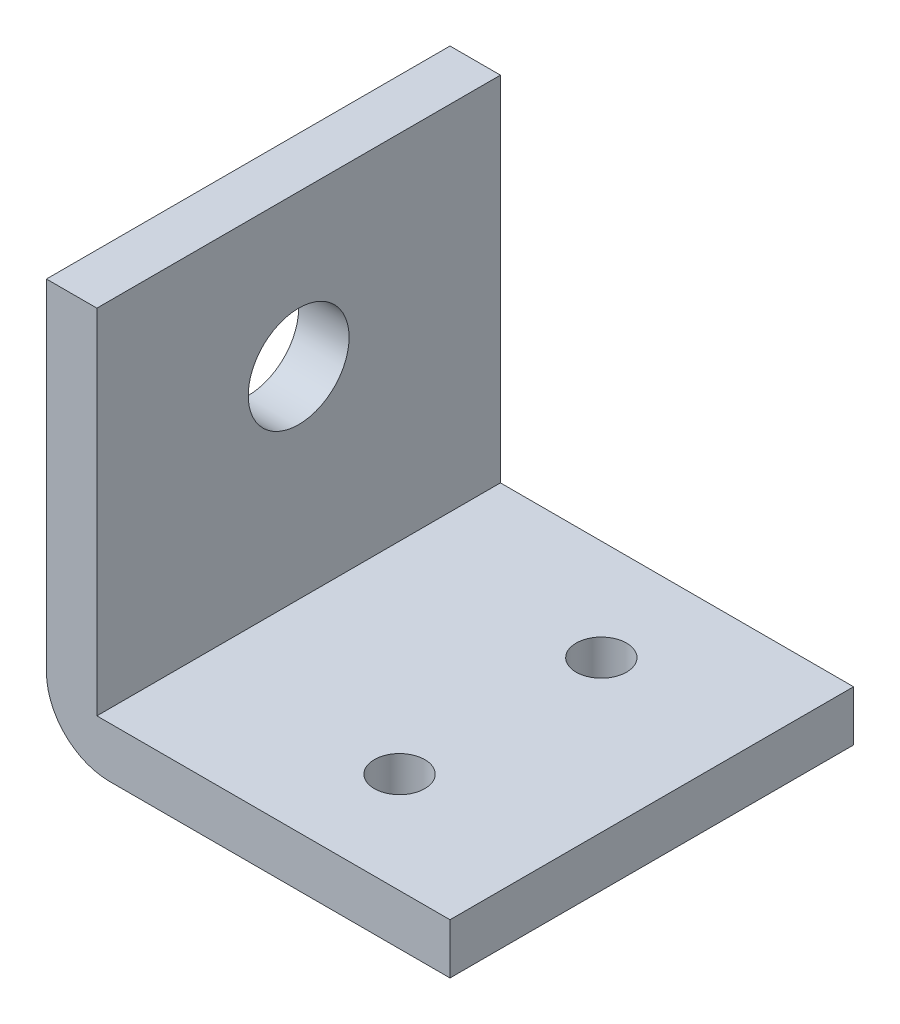
ISO-10303-21;
HEADER;
FILE_DESCRIPTION(('STEP AP214'),'2;1');
FILE_NAME('part.step','',(''),(''),'','','');
FILE_SCHEMA(('AUTOMOTIVE_DESIGN { 1 0 10303 214 1 1 1 1 }'));
ENDSEC;
DATA;
#1=APPLICATION_CONTEXT('core data for automotive mechanical design processes');
#2=APPLICATION_PROTOCOL_DEFINITION('international standard','automotive_design',2000,#1);
#3=PRODUCT_CONTEXT('',#1,'mechanical');
#4=PRODUCT('Part','Part','',(#3));
#5=PRODUCT_RELATED_PRODUCT_CATEGORY('part','',(#4));
#6=PRODUCT_DEFINITION_FORMATION('','',#4);
#7=PRODUCT_DEFINITION_CONTEXT('part definition',#1,'design');
#8=PRODUCT_DEFINITION('design','',#6,#7);
#9=PRODUCT_DEFINITION_SHAPE('','',#8);
#10=(LENGTH_UNIT() NAMED_UNIT(*) SI_UNIT(.MILLI.,.METRE.));
#11=(NAMED_UNIT(*) PLANE_ANGLE_UNIT() SI_UNIT($,.RADIAN.));
#12=(NAMED_UNIT(*) SI_UNIT($,.STERADIAN.) SOLID_ANGLE_UNIT());
#13=UNCERTAINTY_MEASURE_WITH_UNIT(LENGTH_MEASURE(1.E-05),#10,'distance_accuracy_value','');
#14=(GEOMETRIC_REPRESENTATION_CONTEXT(3) GLOBAL_UNCERTAINTY_ASSIGNED_CONTEXT((#13)) GLOBAL_UNIT_ASSIGNED_CONTEXT((#10,
#11,#12)) REPRESENTATION_CONTEXT('',''));
#15=CARTESIAN_POINT('',(0.,0.,0.));
#16=DIRECTION('',(0.,0.,1.));
#17=DIRECTION('',(1.,0.,0.));
#18=AXIS2_PLACEMENT_3D('',#15,#16,#17);
#19=CARTESIAN_POINT('',(5.,40.,20.));
#20=DIRECTION('',(0.,-1.,0.));
#21=DIRECTION('',(0.,0.,-1.));
#22=AXIS2_PLACEMENT_3D('',#19,#20,#21);
#23=PLANE('',#22);
#24=DIRECTION('',(-1.,0.,0.));
#25=VECTOR('',#24,1.);
#26=CARTESIAN_POINT('',(5.,40.,-20.));
#27=LINE('',#26,#25);
#28=CARTESIAN_POINT('',(5.,40.,-20.));
#29=VERTEX_POINT('',#28);
#30=CARTESIAN_POINT('',(0.,40.,-20.));
#31=VERTEX_POINT('',#30);
#32=EDGE_CURVE('E109',#29,#31,#27,.T.);
#33=ORIENTED_EDGE('',*,*,#32,.T.);
#34=DIRECTION('',(0.,0.,-1.));
#35=VECTOR('',#34,1.);
#36=CARTESIAN_POINT('',(0.,40.,20.));
#37=LINE('',#36,#35);
#38=CARTESIAN_POINT('',(0.,40.,20.));
#39=VERTEX_POINT('',#38);
#40=EDGE_CURVE('E92',#39,#31,#37,.T.);
#41=ORIENTED_EDGE('',*,*,#40,.F.);
#42=DIRECTION('',(-1.,0.,0.));
#43=VECTOR('',#42,1.);
#44=CARTESIAN_POINT('',(5.,40.,20.));
#45=LINE('',#44,#43);
#46=CARTESIAN_POINT('',(5.,40.,20.));
#47=VERTEX_POINT('',#46);
#48=EDGE_CURVE('E97',#47,#39,#45,.T.);
#49=ORIENTED_EDGE('',*,*,#48,.F.);
#50=DIRECTION('',(0.,0.,-1.));
#51=VECTOR('',#50,1.);
#52=CARTESIAN_POINT('',(5.,40.,20.));
#53=LINE('',#52,#51);
#54=EDGE_CURVE('E125',#47,#29,#53,.T.);
#55=ORIENTED_EDGE('',*,*,#54,.T.);
#56=EDGE_LOOP('',(#33,#41,#49,#55));
#57=FACE_BOUND('',#56,.T.);
#58=ADVANCED_FACE('F33',(#57),#23,.F.);
#59=CARTESIAN_POINT('',(0.,40.,20.));
#60=DIRECTION('',(1.,0.,0.));
#61=DIRECTION('',(0.,0.,-1.));
#62=AXIS2_PLACEMENT_3D('',#59,#60,#61);
#63=PLANE('',#62);
#64=CARTESIAN_POINT('',(0.,25.,0.));
#65=DIRECTION('',(1.,0.,0.));
#66=DIRECTION('',(0.,0.,-1.));
#67=AXIS2_PLACEMENT_3D('',#64,#65,#66);
#68=CIRCLE('',#67,5.);
#69=CARTESIAN_POINT('',(0.,25.,-5.));
#70=VERTEX_POINT('',#69);
#71=EDGE_CURVE('E137',#70,#70,#68,.T.);
#72=ORIENTED_EDGE('',*,*,#71,.T.);
#73=EDGE_LOOP('',(#72));
#74=FACE_BOUND('',#73,.T.);
#75=DIRECTION('',(0.,-1.,0.));
#76=VECTOR('',#75,1.);
#77=CARTESIAN_POINT('',(0.,40.,-20.));
#78=LINE('',#77,#76);
#79=CARTESIAN_POINT('',(0.,6.25,-20.));
#80=VERTEX_POINT('',#79);
#81=EDGE_CURVE('E134',#31,#80,#78,.T.);
#82=ORIENTED_EDGE('',*,*,#81,.T.);
#83=DIRECTION('',(0.,0.,-1.));
#84=VECTOR('',#83,1.);
#85=CARTESIAN_POINT('',(0.,6.25,20.));
#86=LINE('',#85,#84);
#87=CARTESIAN_POINT('',(0.,6.25,20.));
#88=VERTEX_POINT('',#87);
#89=EDGE_CURVE('E41',#80,#88,#86,.F.);
#90=ORIENTED_EDGE('',*,*,#89,.T.);
#91=DIRECTION('',(0.,-1.,0.));
#92=VECTOR('',#91,1.);
#93=CARTESIAN_POINT('',(0.,40.,20.));
#94=LINE('',#93,#92);
#95=EDGE_CURVE('E88',#39,#88,#94,.T.);
#96=ORIENTED_EDGE('',*,*,#95,.F.);
#97=ORIENTED_EDGE('',*,*,#40,.T.);
#98=EDGE_LOOP('',(#82,#90,#96,#97));
#99=FACE_BOUND('',#98,.T.);
#100=ADVANCED_FACE('F90',(#74,#99),#63,.F.);
#101=CARTESIAN_POINT('',(0.,0.,20.));
#102=DIRECTION('',(0.,1.,0.));
#103=DIRECTION('',(0.,0.,1.));
#104=AXIS2_PLACEMENT_3D('',#101,#102,#103);
#105=PLANE('',#104);
#106=CARTESIAN_POINT('',(25.,0.,10.));
#107=DIRECTION('',(0.,1.,0.));
#108=DIRECTION('',(0.,0.,1.));
#109=AXIS2_PLACEMENT_3D('',#106,#107,#108);
#110=CIRCLE('',#109,2.5);
#111=CARTESIAN_POINT('',(25.,0.,12.5));
#112=VERTEX_POINT('',#111);
#113=EDGE_CURVE('E155',#112,#112,#110,.T.);
#114=ORIENTED_EDGE('',*,*,#113,.T.);
#115=EDGE_LOOP('',(#114));
#116=FACE_BOUND('',#115,.T.);
#117=CARTESIAN_POINT('',(25.,0.,-10.));
#118=DIRECTION('',(0.,1.,0.));
#119=DIRECTION('',(0.,0.,1.));
#120=AXIS2_PLACEMENT_3D('',#117,#118,#119);
#121=CIRCLE('',#120,2.5);
#122=CARTESIAN_POINT('',(25.,0.,-7.5));
#123=VERTEX_POINT('',#122);
#124=EDGE_CURVE('E149',#123,#123,#121,.T.);
#125=ORIENTED_EDGE('',*,*,#124,.T.);
#126=EDGE_LOOP('',(#125));
#127=FACE_BOUND('',#126,.T.);
#128=DIRECTION('',(1.,0.,0.));
#129=VECTOR('',#128,1.);
#130=CARTESIAN_POINT('',(0.,0.,20.));
#131=LINE('',#130,#129);
#132=CARTESIAN_POINT('',(6.25,0.,20.));
#133=VERTEX_POINT('',#132);
#134=CARTESIAN_POINT('',(40.,0.,20.));
#135=VERTEX_POINT('',#134);
#136=EDGE_CURVE('E96',#133,#135,#131,.T.);
#137=ORIENTED_EDGE('',*,*,#136,.F.);
#138=DIRECTION('',(0.,0.,-1.));
#139=VECTOR('',#138,1.);
#140=CARTESIAN_POINT('',(6.25,0.,20.));
#141=LINE('',#140,#139);
#142=CARTESIAN_POINT('',(6.25,0.,-20.));
#143=VERTEX_POINT('',#142);
#144=EDGE_CURVE('E110',#133,#143,#141,.T.);
#145=ORIENTED_EDGE('',*,*,#144,.T.);
#146=DIRECTION('',(1.,0.,0.));
#147=VECTOR('',#146,1.);
#148=CARTESIAN_POINT('',(0.,0.,-20.));
#149=LINE('',#148,#147);
#150=CARTESIAN_POINT('',(40.,0.,-20.));
#151=VERTEX_POINT('',#150);
#152=EDGE_CURVE('E132',#143,#151,#149,.T.);
#153=ORIENTED_EDGE('',*,*,#152,.T.);
#154=DIRECTION('',(0.,0.,-1.));
#155=VECTOR('',#154,1.);
#156=CARTESIAN_POINT('',(40.,0.,20.));
#157=LINE('',#156,#155);
#158=EDGE_CURVE('E111',#135,#151,#157,.T.);
#159=ORIENTED_EDGE('',*,*,#158,.F.);
#160=EDGE_LOOP('',(#137,#145,#153,#159));
#161=FACE_BOUND('',#160,.T.);
#162=ADVANCED_FACE('F185',(#116,#127,#161),#105,.F.);
#163=CARTESIAN_POINT('',(40.,0.,20.));
#164=DIRECTION('',(-1.,0.,0.));
#165=DIRECTION('',(0.,0.,1.));
#166=AXIS2_PLACEMENT_3D('',#163,#164,#165);
#167=PLANE('',#166);
#168=DIRECTION('',(0.,1.,0.));
#169=VECTOR('',#168,1.);
#170=CARTESIAN_POINT('',(40.,0.,-20.));
#171=LINE('',#170,#169);
#172=CARTESIAN_POINT('',(40.,5.,-20.));
#173=VERTEX_POINT('',#172);
#174=EDGE_CURVE('E130',#151,#173,#171,.T.);
#175=ORIENTED_EDGE('',*,*,#174,.T.);
#176=DIRECTION('',(0.,0.,-1.));
#177=VECTOR('',#176,1.);
#178=CARTESIAN_POINT('',(40.,5.,20.));
#179=LINE('',#178,#177);
#180=CARTESIAN_POINT('',(40.,5.,20.));
#181=VERTEX_POINT('',#180);
#182=EDGE_CURVE('E116',#181,#173,#179,.T.);
#183=ORIENTED_EDGE('',*,*,#182,.F.);
#184=DIRECTION('',(0.,1.,0.));
#185=VECTOR('',#184,1.);
#186=CARTESIAN_POINT('',(40.,0.,20.));
#187=LINE('',#186,#185);
#188=EDGE_CURVE('E141',#135,#181,#187,.T.);
#189=ORIENTED_EDGE('',*,*,#188,.F.);
#190=ORIENTED_EDGE('',*,*,#158,.T.);
#191=EDGE_LOOP('',(#175,#183,#189,#190));
#192=FACE_BOUND('',#191,.T.);
#193=ADVANCED_FACE('F168',(#192),#167,.F.);
#194=CARTESIAN_POINT('',(40.,5.,20.));
#195=DIRECTION('',(0.,-1.,0.));
#196=DIRECTION('',(1.,0.,0.));
#197=AXIS2_PLACEMENT_3D('',#194,#195,#196);
#198=PLANE('',#197);
#199=CARTESIAN_POINT('',(25.,5.,10.));
#200=DIRECTION('',(0.,1.,0.));
#201=DIRECTION('',(0.,0.,1.));
#202=AXIS2_PLACEMENT_3D('',#199,#200,#201);
#203=CIRCLE('',#202,2.5);
#204=CARTESIAN_POINT('',(25.,5.,12.5));
#205=VERTEX_POINT('',#204);
#206=EDGE_CURVE('E158',#205,#205,#203,.T.);
#207=ORIENTED_EDGE('',*,*,#206,.F.);
#208=EDGE_LOOP('',(#207));
#209=FACE_BOUND('',#208,.T.);
#210=CARTESIAN_POINT('',(25.,5.,-10.));
#211=DIRECTION('',(0.,1.,0.));
#212=DIRECTION('',(0.,0.,1.));
#213=AXIS2_PLACEMENT_3D('',#210,#211,#212);
#214=CIRCLE('',#213,2.5);
#215=CARTESIAN_POINT('',(25.,5.,-7.5));
#216=VERTEX_POINT('',#215);
#217=EDGE_CURVE('E152',#216,#216,#214,.T.);
#218=ORIENTED_EDGE('',*,*,#217,.F.);
#219=EDGE_LOOP('',(#218));
#220=FACE_BOUND('',#219,.T.);
#221=DIRECTION('',(-1.,0.,0.));
#222=VECTOR('',#221,1.);
#223=CARTESIAN_POINT('',(40.,5.,-20.));
#224=LINE('',#223,#222);
#225=CARTESIAN_POINT('',(5.,5.,-20.));
#226=VERTEX_POINT('',#225);
#227=EDGE_CURVE('E128',#173,#226,#224,.T.);
#228=ORIENTED_EDGE('',*,*,#227,.T.);
#229=DIRECTION('',(0.,0.,-1.));
#230=VECTOR('',#229,1.);
#231=CARTESIAN_POINT('',(5.,5.,20.));
#232=LINE('',#231,#230);
#233=CARTESIAN_POINT('',(5.,5.,20.));
#234=VERTEX_POINT('',#233);
#235=EDGE_CURVE('E122',#234,#226,#232,.T.);
#236=ORIENTED_EDGE('',*,*,#235,.F.);
#237=DIRECTION('',(-1.,0.,0.));
#238=VECTOR('',#237,1.);
#239=CARTESIAN_POINT('',(40.,5.,20.));
#240=LINE('',#239,#238);
#241=EDGE_CURVE('E139',#181,#234,#240,.T.);
#242=ORIENTED_EDGE('',*,*,#241,.F.);
#243=ORIENTED_EDGE('',*,*,#182,.T.);
#244=EDGE_LOOP('',(#228,#236,#242,#243));
#245=FACE_BOUND('',#244,.T.);
#246=ADVANCED_FACE('F164',(#209,#220,#245),#198,.F.);
#247=CARTESIAN_POINT('',(5.,5.,20.));
#248=DIRECTION('',(-1.,0.,0.));
#249=DIRECTION('',(0.,-1.,0.));
#250=AXIS2_PLACEMENT_3D('',#247,#248,#249);
#251=PLANE('',#250);
#252=CARTESIAN_POINT('',(5.,25.,0.));
#253=DIRECTION('',(1.,0.,0.));
#254=DIRECTION('',(0.,0.,-1.));
#255=AXIS2_PLACEMENT_3D('',#252,#253,#254);
#256=CIRCLE('',#255,5.);
#257=CARTESIAN_POINT('',(5.,25.,-5.));
#258=VERTEX_POINT('',#257);
#259=EDGE_CURVE('E146',#258,#258,#256,.T.);
#260=ORIENTED_EDGE('',*,*,#259,.F.);
#261=EDGE_LOOP('',(#260));
#262=FACE_BOUND('',#261,.T.);
#263=DIRECTION('',(0.,1.,0.));
#264=VECTOR('',#263,1.);
#265=CARTESIAN_POINT('',(5.,5.,-20.));
#266=LINE('',#265,#264);
#267=EDGE_CURVE('E106',#226,#29,#266,.T.);
#268=ORIENTED_EDGE('',*,*,#267,.T.);
#269=ORIENTED_EDGE('',*,*,#54,.F.);
#270=DIRECTION('',(0.,1.,0.));
#271=VECTOR('',#270,1.);
#272=CARTESIAN_POINT('',(5.,5.,20.));
#273=LINE('',#272,#271);
#274=EDGE_CURVE('E102',#234,#47,#273,.T.);
#275=ORIENTED_EDGE('',*,*,#274,.F.);
#276=ORIENTED_EDGE('',*,*,#235,.T.);
#277=EDGE_LOOP('',(#268,#269,#275,#276));
#278=FACE_BOUND('',#277,.T.);
#279=ADVANCED_FACE('F167',(#262,#278),#251,.F.);
#280=CARTESIAN_POINT('',(0.,0.,20.));
#281=DIRECTION('',(0.,0.,1.));
#282=DIRECTION('',(1.,0.,0.));
#283=AXIS2_PLACEMENT_3D('',#280,#281,#282);
#284=PLANE('',#283);
#285=ORIENTED_EDGE('',*,*,#95,.T.);
#286=CARTESIAN_POINT('',(6.25,6.25,20.));
#287=DIRECTION('',(0.,0.,1.));
#288=DIRECTION('',(1.,0.,0.));
#289=AXIS2_PLACEMENT_3D('',#286,#287,#288);
#290=CIRCLE('',#289,6.25);
#291=EDGE_CURVE('E11',#88,#133,#290,.T.);
#292=ORIENTED_EDGE('',*,*,#291,.T.);
#293=ORIENTED_EDGE('',*,*,#136,.T.);
#294=ORIENTED_EDGE('',*,*,#188,.T.);
#295=ORIENTED_EDGE('',*,*,#241,.T.);
#296=ORIENTED_EDGE('',*,*,#274,.T.);
#297=ORIENTED_EDGE('',*,*,#48,.T.);
#298=EDGE_LOOP('',(#285,#292,#293,#294,#295,#296,#297));
#299=FACE_BOUND('',#298,.T.);
#300=ADVANCED_FACE('F100',(#299),#284,.T.);
#301=CARTESIAN_POINT('',(0.,0.,-20.));
#302=DIRECTION('',(0.,0.,1.));
#303=DIRECTION('',(1.,0.,0.));
#304=AXIS2_PLACEMENT_3D('',#301,#302,#303);
#305=PLANE('',#304);
#306=ORIENTED_EDGE('',*,*,#152,.F.);
#307=CARTESIAN_POINT('',(6.25,6.25,-20.));
#308=DIRECTION('',(0.,0.,1.));
#309=DIRECTION('',(1.,0.,0.));
#310=AXIS2_PLACEMENT_3D('',#307,#308,#309);
#311=CIRCLE('',#310,6.25);
#312=EDGE_CURVE('E55',#143,#80,#311,.F.);
#313=ORIENTED_EDGE('',*,*,#312,.T.);
#314=ORIENTED_EDGE('',*,*,#81,.F.);
#315=ORIENTED_EDGE('',*,*,#32,.F.);
#316=ORIENTED_EDGE('',*,*,#267,.F.);
#317=ORIENTED_EDGE('',*,*,#227,.F.);
#318=ORIENTED_EDGE('',*,*,#174,.F.);
#319=EDGE_LOOP('',(#306,#313,#314,#315,#316,#317,#318));
#320=FACE_BOUND('',#319,.T.);
#321=ADVANCED_FACE('F179',(#320),#305,.F.);
#322=CARTESIAN_POINT('',(6.25,6.25,20.));
#323=DIRECTION('',(0.,0.,-1.));
#324=DIRECTION('',(-1.,0.,0.));
#325=AXIS2_PLACEMENT_3D('',#322,#323,#324);
#326=CYLINDRICAL_SURFACE('',#325,6.25);
#327=ORIENTED_EDGE('',*,*,#291,.F.);
#328=ORIENTED_EDGE('',*,*,#89,.F.);
#329=ORIENTED_EDGE('',*,*,#312,.F.);
#330=ORIENTED_EDGE('',*,*,#144,.F.);
#331=EDGE_LOOP('',(#327,#328,#329,#330));
#332=FACE_BOUND('',#331,.T.);
#333=ADVANCED_FACE('F35',(#332),#326,.T.);
#334=CARTESIAN_POINT('',(5.,25.,0.));
#335=DIRECTION('',(1.,0.,0.));
#336=DIRECTION('',(0.,0.,-1.));
#337=AXIS2_PLACEMENT_3D('',#334,#335,#336);
#338=CYLINDRICAL_SURFACE('',#337,5.);
#339=ORIENTED_EDGE('',*,*,#71,.F.);
#340=EDGE_LOOP('',(#339));
#341=FACE_BOUND('',#340,.T.);
#342=ORIENTED_EDGE('',*,*,#259,.T.);
#343=EDGE_LOOP('',(#342));
#344=FACE_BOUND('',#343,.T.);
#345=ADVANCED_FACE('F205',(#341,#344),#338,.F.);
#346=CARTESIAN_POINT('',(25.,5.,-10.));
#347=DIRECTION('',(0.,1.,0.));
#348=DIRECTION('',(0.,0.,1.));
#349=AXIS2_PLACEMENT_3D('',#346,#347,#348);
#350=CYLINDRICAL_SURFACE('',#349,2.5);
#351=ORIENTED_EDGE('',*,*,#124,.F.);
#352=EDGE_LOOP('',(#351));
#353=FACE_BOUND('',#352,.T.);
#354=ORIENTED_EDGE('',*,*,#217,.T.);
#355=EDGE_LOOP('',(#354));
#356=FACE_BOUND('',#355,.T.);
#357=ADVANCED_FACE('F208',(#353,#356),#350,.F.);
#358=CARTESIAN_POINT('',(25.,5.,10.));
#359=DIRECTION('',(0.,1.,0.));
#360=DIRECTION('',(0.,0.,1.));
#361=AXIS2_PLACEMENT_3D('',#358,#359,#360);
#362=CYLINDRICAL_SURFACE('',#361,2.5);
#363=ORIENTED_EDGE('',*,*,#113,.F.);
#364=EDGE_LOOP('',(#363));
#365=FACE_BOUND('',#364,.T.);
#366=ORIENTED_EDGE('',*,*,#206,.T.);
#367=EDGE_LOOP('',(#366));
#368=FACE_BOUND('',#367,.T.);
#369=ADVANCED_FACE('F162',(#365,#368),#362,.F.);
#370=CLOSED_SHELL('',(#58,#100,#162,#193,#246,#279,#300,#321,#333,#345,#357,#369));
#371=MANIFOLD_SOLID_BREP('B2',#370);
#372=ADVANCED_BREP_SHAPE_REPRESENTATION('',(#18,#371),#14);
#373=SHAPE_DEFINITION_REPRESENTATION(#9,#372);
ENDSEC;
END-ISO-10303-21;
